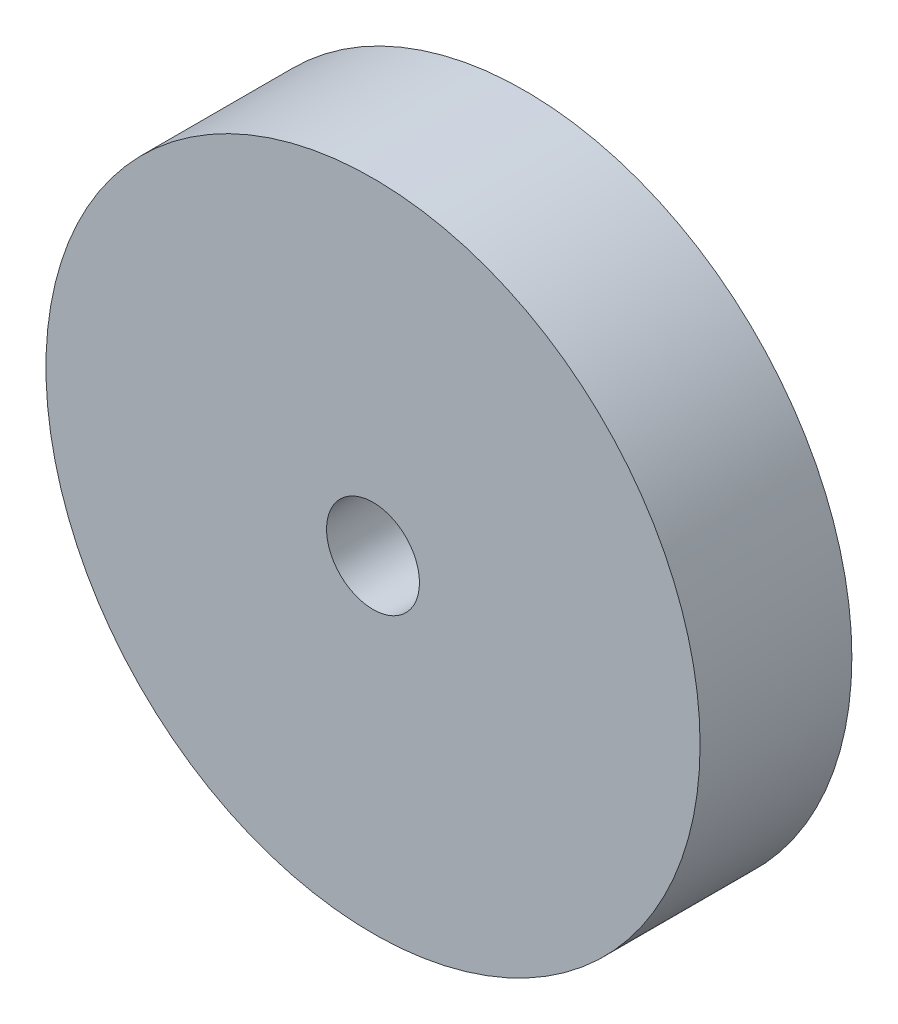
ISO-10303-21;
HEADER;
FILE_DESCRIPTION(('STEP AP214'),'2;1');
FILE_NAME('part.step','',(''),(''),'','','');
FILE_SCHEMA(('AUTOMOTIVE_DESIGN { 1 0 10303 214 1 1 1 1 }'));
ENDSEC;
DATA;
#1=APPLICATION_CONTEXT('core data for automotive mechanical design processes');
#2=APPLICATION_PROTOCOL_DEFINITION('international standard','automotive_design',2000,#1);
#3=PRODUCT_CONTEXT('',#1,'mechanical');
#4=PRODUCT('Part','Part','',(#3));
#5=PRODUCT_RELATED_PRODUCT_CATEGORY('part','',(#4));
#6=PRODUCT_DEFINITION_FORMATION('','',#4);
#7=PRODUCT_DEFINITION_CONTEXT('part definition',#1,'design');
#8=PRODUCT_DEFINITION('design','',#6,#7);
#9=PRODUCT_DEFINITION_SHAPE('','',#8);
#10=(LENGTH_UNIT() NAMED_UNIT(*) SI_UNIT(.MILLI.,.METRE.));
#11=(NAMED_UNIT(*) PLANE_ANGLE_UNIT() SI_UNIT($,.RADIAN.));
#12=(NAMED_UNIT(*) SI_UNIT($,.STERADIAN.) SOLID_ANGLE_UNIT());
#13=UNCERTAINTY_MEASURE_WITH_UNIT(LENGTH_MEASURE(1.E-05),#10,'distance_accuracy_value','');
#14=(GEOMETRIC_REPRESENTATION_CONTEXT(3) GLOBAL_UNCERTAINTY_ASSIGNED_CONTEXT((#13)) GLOBAL_UNIT_ASSIGNED_CONTEXT((#10,
#11,#12)) REPRESENTATION_CONTEXT('',''));
#15=CARTESIAN_POINT('',(0.,0.,0.));
#16=DIRECTION('',(0.,0.,1.));
#17=DIRECTION('',(1.,0.,0.));
#18=AXIS2_PLACEMENT_3D('',#15,#16,#17);
#19=CARTESIAN_POINT('',(0.,0.,10.));
#20=DIRECTION('',(0.,0.,-1.));
#21=DIRECTION('',(-1.,0.,0.));
#22=AXIS2_PLACEMENT_3D('',#19,#20,#21);
#23=CYLINDRICAL_SURFACE('',#22,21.55);
#24=CARTESIAN_POINT('',(0.,0.,10.));
#25=DIRECTION('',(0.,0.,1.));
#26=DIRECTION('',(1.,0.,0.));
#27=AXIS2_PLACEMENT_3D('',#24,#25,#26);
#28=CIRCLE('',#27,21.55);
#29=CARTESIAN_POINT('',(21.55,0.,10.));
#30=VERTEX_POINT('',#29);
#31=EDGE_CURVE('E10',#30,#30,#28,.T.);
#32=ORIENTED_EDGE('',*,*,#31,.F.);
#33=EDGE_LOOP('',(#32));
#34=FACE_BOUND('',#33,.T.);
#35=CARTESIAN_POINT('',(0.,0.,0.));
#36=DIRECTION('',(0.,0.,1.));
#37=DIRECTION('',(1.,0.,0.));
#38=AXIS2_PLACEMENT_3D('',#35,#36,#37);
#39=CIRCLE('',#38,21.55);
#40=CARTESIAN_POINT('',(21.55,0.,0.));
#41=VERTEX_POINT('',#40);
#42=EDGE_CURVE('E35',#41,#41,#39,.T.);
#43=ORIENTED_EDGE('',*,*,#42,.T.);
#44=EDGE_LOOP('',(#43));
#45=FACE_BOUND('',#44,.T.);
#46=ADVANCED_FACE('F32',(#34,#45),#23,.T.);
#47=CARTESIAN_POINT('',(0.,0.,10.));
#48=DIRECTION('',(0.,0.,1.));
#49=DIRECTION('',(1.,0.,0.));
#50=AXIS2_PLACEMENT_3D('',#47,#48,#49);
#51=PLANE('',#50);
#52=CARTESIAN_POINT('',(0.,0.,10.));
#53=DIRECTION('',(0.,0.,1.));
#54=DIRECTION('',(1.,0.,0.));
#55=AXIS2_PLACEMENT_3D('',#52,#53,#54);
#56=CIRCLE('',#55,3.06);
#57=CARTESIAN_POINT('',(3.06,0.,10.));
#58=VERTEX_POINT('',#57);
#59=EDGE_CURVE('E44',#58,#58,#56,.T.);
#60=ORIENTED_EDGE('',*,*,#59,.F.);
#61=EDGE_LOOP('',(#60));
#62=FACE_BOUND('',#61,.T.);
#63=ORIENTED_EDGE('',*,*,#31,.T.);
#64=EDGE_LOOP('',(#63));
#65=FACE_BOUND('',#64,.T.);
#66=ADVANCED_FACE('F59',(#62,#65),#51,.T.);
#67=CARTESIAN_POINT('',(0.,0.,0.));
#68=DIRECTION('',(0.,0.,1.));
#69=DIRECTION('',(1.,0.,0.));
#70=AXIS2_PLACEMENT_3D('',#67,#68,#69);
#71=PLANE('',#70);
#72=CARTESIAN_POINT('',(0.,0.,0.));
#73=DIRECTION('',(0.,0.,1.));
#74=DIRECTION('',(1.,0.,0.));
#75=AXIS2_PLACEMENT_3D('',#72,#73,#74);
#76=CIRCLE('',#75,3.06);
#77=CARTESIAN_POINT('',(3.06,0.,0.));
#78=VERTEX_POINT('',#77);
#79=EDGE_CURVE('E42',#78,#78,#76,.T.);
#80=ORIENTED_EDGE('',*,*,#79,.T.);
#81=EDGE_LOOP('',(#80));
#82=FACE_BOUND('',#81,.T.);
#83=ORIENTED_EDGE('',*,*,#42,.F.);
#84=EDGE_LOOP('',(#83));
#85=FACE_BOUND('',#84,.T.);
#86=ADVANCED_FACE('F50',(#82,#85),#71,.F.);
#87=CARTESIAN_POINT('',(0.,0.,0.));
#88=DIRECTION('',(0.,0.,1.));
#89=DIRECTION('',(1.,0.,0.));
#90=AXIS2_PLACEMENT_3D('',#87,#88,#89);
#91=CYLINDRICAL_SURFACE('',#90,3.06);
#92=ORIENTED_EDGE('',*,*,#79,.F.);
#93=EDGE_LOOP('',(#92));
#94=FACE_BOUND('',#93,.T.);
#95=ORIENTED_EDGE('',*,*,#59,.T.);
#96=EDGE_LOOP('',(#95));
#97=FACE_BOUND('',#96,.T.);
#98=ADVANCED_FACE('F53',(#94,#97),#91,.F.);
#99=CLOSED_SHELL('',(#46,#66,#86,#98));
#100=MANIFOLD_SOLID_BREP('B2',#99);
#101=ADVANCED_BREP_SHAPE_REPRESENTATION('',(#18,#100),#14);
#102=SHAPE_DEFINITION_REPRESENTATION(#9,#101);
ENDSEC;
END-ISO-10303-21;
